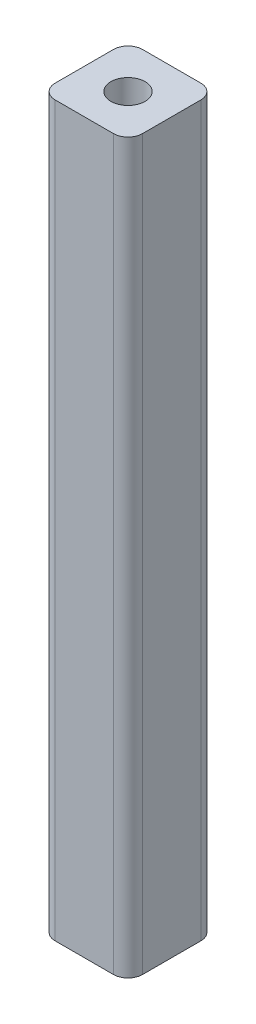
ISO-10303-21;
HEADER;
FILE_DESCRIPTION(('STEP AP214'),'2;1');
FILE_NAME('part.step','',(''),(''),'','','');
FILE_SCHEMA(('AUTOMOTIVE_DESIGN { 1 0 10303 214 1 1 1 1 }'));
ENDSEC;
DATA;
#1=APPLICATION_CONTEXT('core data for automotive mechanical design processes');
#2=APPLICATION_PROTOCOL_DEFINITION('international standard','automotive_design',2000,#1);
#3=PRODUCT_CONTEXT('',#1,'mechanical');
#4=PRODUCT('Part','Part','',(#3));
#5=PRODUCT_RELATED_PRODUCT_CATEGORY('part','',(#4));
#6=PRODUCT_DEFINITION_FORMATION('','',#4);
#7=PRODUCT_DEFINITION_CONTEXT('part definition',#1,'design');
#8=PRODUCT_DEFINITION('design','',#6,#7);
#9=PRODUCT_DEFINITION_SHAPE('','',#8);
#10=(LENGTH_UNIT() NAMED_UNIT(*) SI_UNIT(.MILLI.,.METRE.));
#11=(NAMED_UNIT(*) PLANE_ANGLE_UNIT() SI_UNIT($,.RADIAN.));
#12=(NAMED_UNIT(*) SI_UNIT($,.STERADIAN.) SOLID_ANGLE_UNIT());
#13=UNCERTAINTY_MEASURE_WITH_UNIT(LENGTH_MEASURE(1.E-05),#10,'distance_accuracy_value','');
#14=(GEOMETRIC_REPRESENTATION_CONTEXT(3) GLOBAL_UNCERTAINTY_ASSIGNED_CONTEXT((#13)) GLOBAL_UNIT_ASSIGNED_CONTEXT((#10,
#11,#12)) REPRESENTATION_CONTEXT('',''));
#15=CARTESIAN_POINT('',(0.,0.,0.));
#16=DIRECTION('',(0.,0.,1.));
#17=DIRECTION('',(1.,0.,0.));
#18=AXIS2_PLACEMENT_3D('',#15,#16,#17);
#19=CARTESIAN_POINT('',(0.,100.,0.));
#20=DIRECTION('',(0.,1.,0.));
#21=DIRECTION('',(0.,0.,1.));
#22=AXIS2_PLACEMENT_3D('',#19,#20,#21);
#23=PLANE('',#22);
#24=DIRECTION('',(0.,0.,1.));
#25=VECTOR('',#24,1.);
#26=CARTESIAN_POINT('',(-6.,100.,-6.));
#27=LINE('',#26,#25);
#28=CARTESIAN_POINT('',(-6.,100.,-4.));
#29=VERTEX_POINT('',#28);
#30=CARTESIAN_POINT('',(-6.,100.,4.));
#31=VERTEX_POINT('',#30);
#32=EDGE_CURVE('E138',#29,#31,#27,.T.);
#33=ORIENTED_EDGE('',*,*,#32,.T.);
#34=CARTESIAN_POINT('',(-4.,100.,4.));
#35=DIRECTION('',(0.,1.,0.));
#36=DIRECTION('',(0.,0.,1.));
#37=AXIS2_PLACEMENT_3D('',#34,#35,#36);
#38=CIRCLE('',#37,2.);
#39=CARTESIAN_POINT('',(-4.,100.,6.));
#40=VERTEX_POINT('',#39);
#41=EDGE_CURVE('E153',#31,#40,#38,.T.);
#42=ORIENTED_EDGE('',*,*,#41,.T.);
#43=DIRECTION('',(1.,0.,0.));
#44=VECTOR('',#43,1.);
#45=CARTESIAN_POINT('',(-6.,100.,6.));
#46=LINE('',#45,#44);
#47=CARTESIAN_POINT('',(4.,100.,6.));
#48=VERTEX_POINT('',#47);
#49=EDGE_CURVE('E120',#40,#48,#46,.T.);
#50=ORIENTED_EDGE('',*,*,#49,.T.);
#51=CARTESIAN_POINT('',(4.,100.,4.));
#52=DIRECTION('',(0.,1.,0.));
#53=DIRECTION('',(0.,0.,1.));
#54=AXIS2_PLACEMENT_3D('',#51,#52,#53);
#55=CIRCLE('',#54,2.);
#56=CARTESIAN_POINT('',(6.,100.,4.));
#57=VERTEX_POINT('',#56);
#58=EDGE_CURVE('E148',#48,#57,#55,.T.);
#59=ORIENTED_EDGE('',*,*,#58,.T.);
#60=DIRECTION('',(0.,0.,-1.));
#61=VECTOR('',#60,1.);
#62=CARTESIAN_POINT('',(6.,100.,-6.));
#63=LINE('',#62,#61);
#64=CARTESIAN_POINT('',(6.,100.,-4.));
#65=VERTEX_POINT('',#64);
#66=EDGE_CURVE('E164',#57,#65,#63,.T.);
#67=ORIENTED_EDGE('',*,*,#66,.T.);
#68=CARTESIAN_POINT('',(4.,100.,-4.));
#69=DIRECTION('',(0.,1.,0.));
#70=DIRECTION('',(0.,0.,1.));
#71=AXIS2_PLACEMENT_3D('',#68,#69,#70);
#72=CIRCLE('',#71,2.);
#73=CARTESIAN_POINT('',(4.,100.,-6.));
#74=VERTEX_POINT('',#73);
#75=EDGE_CURVE('E56',#65,#74,#72,.T.);
#76=ORIENTED_EDGE('',*,*,#75,.T.);
#77=DIRECTION('',(-1.,0.,0.));
#78=VECTOR('',#77,1.);
#79=CARTESIAN_POINT('',(-6.,100.,-6.));
#80=LINE('',#79,#78);
#81=CARTESIAN_POINT('',(-4.,100.,-6.));
#82=VERTEX_POINT('',#81);
#83=EDGE_CURVE('E139',#74,#82,#80,.T.);
#84=ORIENTED_EDGE('',*,*,#83,.T.);
#85=CARTESIAN_POINT('',(-4.,100.,-4.));
#86=DIRECTION('',(0.,1.,0.));
#87=DIRECTION('',(0.,0.,1.));
#88=AXIS2_PLACEMENT_3D('',#85,#86,#87);
#89=CIRCLE('',#88,2.);
#90=EDGE_CURVE('E151',#82,#29,#89,.T.);
#91=ORIENTED_EDGE('',*,*,#90,.T.);
#92=EDGE_LOOP('',(#33,#42,#50,#59,#67,#76,#84,#91));
#93=FACE_BOUND('',#92,.T.);
#94=CARTESIAN_POINT('',(0.,100.,0.));
#95=DIRECTION('',(0.,1.,0.));
#96=DIRECTION('',(0.,0.,1.));
#97=AXIS2_PLACEMENT_3D('',#94,#95,#96);
#98=CIRCLE('',#97,2.35);
#99=CARTESIAN_POINT('',(0.,100.,2.35));
#100=VERTEX_POINT('',#99);
#101=EDGE_CURVE('E133',#100,#100,#98,.T.);
#102=ORIENTED_EDGE('',*,*,#101,.F.);
#103=EDGE_LOOP('',(#102));
#104=FACE_BOUND('',#103,.T.);
#105=ADVANCED_FACE('F34',(#93,#104),#23,.T.);
#106=CARTESIAN_POINT('',(0.,0.,0.));
#107=DIRECTION('',(0.,1.,0.));
#108=DIRECTION('',(0.,0.,1.));
#109=AXIS2_PLACEMENT_3D('',#106,#107,#108);
#110=PLANE('',#109);
#111=DIRECTION('',(1.,0.,0.));
#112=VECTOR('',#111,1.);
#113=CARTESIAN_POINT('',(-6.,0.,6.));
#114=LINE('',#113,#112);
#115=CARTESIAN_POINT('',(-4.,0.,6.));
#116=VERTEX_POINT('',#115);
#117=CARTESIAN_POINT('',(4.,0.,6.));
#118=VERTEX_POINT('',#117);
#119=EDGE_CURVE('E117',#116,#118,#114,.T.);
#120=ORIENTED_EDGE('',*,*,#119,.F.);
#121=CARTESIAN_POINT('',(-4.,0.,4.));
#122=DIRECTION('',(0.,1.,0.));
#123=DIRECTION('',(0.,0.,1.));
#124=AXIS2_PLACEMENT_3D('',#121,#122,#123);
#125=CIRCLE('',#124,2.);
#126=CARTESIAN_POINT('',(-6.,0.,4.));
#127=VERTEX_POINT('',#126);
#128=EDGE_CURVE('E100',#116,#127,#125,.F.);
#129=ORIENTED_EDGE('',*,*,#128,.T.);
#130=DIRECTION('',(0.,0.,1.));
#131=VECTOR('',#130,1.);
#132=CARTESIAN_POINT('',(-6.,0.,-6.));
#133=LINE('',#132,#131);
#134=CARTESIAN_POINT('',(-6.,0.,-4.));
#135=VERTEX_POINT('',#134);
#136=EDGE_CURVE('E128',#135,#127,#133,.T.);
#137=ORIENTED_EDGE('',*,*,#136,.F.);
#138=CARTESIAN_POINT('',(-4.,0.,-4.));
#139=DIRECTION('',(0.,1.,0.));
#140=DIRECTION('',(0.,0.,1.));
#141=AXIS2_PLACEMENT_3D('',#138,#139,#140);
#142=CIRCLE('',#141,2.);
#143=CARTESIAN_POINT('',(-4.,0.,-6.));
#144=VERTEX_POINT('',#143);
#145=EDGE_CURVE('E111',#135,#144,#142,.F.);
#146=ORIENTED_EDGE('',*,*,#145,.T.);
#147=DIRECTION('',(-1.,0.,0.));
#148=VECTOR('',#147,1.);
#149=CARTESIAN_POINT('',(-6.,0.,-6.));
#150=LINE('',#149,#148);
#151=CARTESIAN_POINT('',(4.,0.,-6.));
#152=VERTEX_POINT('',#151);
#153=EDGE_CURVE('E131',#152,#144,#150,.T.);
#154=ORIENTED_EDGE('',*,*,#153,.F.);
#155=CARTESIAN_POINT('',(4.,0.,-4.));
#156=DIRECTION('',(0.,1.,0.));
#157=DIRECTION('',(0.,0.,1.));
#158=AXIS2_PLACEMENT_3D('',#155,#156,#157);
#159=CIRCLE('',#158,2.);
#160=CARTESIAN_POINT('',(6.,0.,-4.));
#161=VERTEX_POINT('',#160);
#162=EDGE_CURVE('E142',#152,#161,#159,.F.);
#163=ORIENTED_EDGE('',*,*,#162,.T.);
#164=DIRECTION('',(0.,0.,-1.));
#165=VECTOR('',#164,1.);
#166=CARTESIAN_POINT('',(6.,0.,-6.));
#167=LINE('',#166,#165);
#168=CARTESIAN_POINT('',(6.,0.,4.));
#169=VERTEX_POINT('',#168);
#170=EDGE_CURVE('E127',#169,#161,#167,.T.);
#171=ORIENTED_EDGE('',*,*,#170,.F.);
#172=CARTESIAN_POINT('',(4.,0.,4.));
#173=DIRECTION('',(0.,1.,0.));
#174=DIRECTION('',(0.,0.,1.));
#175=AXIS2_PLACEMENT_3D('',#172,#173,#174);
#176=CIRCLE('',#175,2.);
#177=EDGE_CURVE('E121',#169,#118,#176,.F.);
#178=ORIENTED_EDGE('',*,*,#177,.T.);
#179=EDGE_LOOP('',(#120,#129,#137,#146,#154,#163,#171,#178));
#180=FACE_BOUND('',#179,.T.);
#181=CARTESIAN_POINT('',(0.,0.,0.));
#182=DIRECTION('',(0.,1.,0.));
#183=DIRECTION('',(0.,0.,1.));
#184=AXIS2_PLACEMENT_3D('',#181,#182,#183);
#185=CIRCLE('',#184,2.35);
#186=CARTESIAN_POINT('',(0.,0.,2.35));
#187=VERTEX_POINT('',#186);
#188=EDGE_CURVE('E178',#187,#187,#185,.T.);
#189=ORIENTED_EDGE('',*,*,#188,.T.);
#190=EDGE_LOOP('',(#189));
#191=FACE_BOUND('',#190,.T.);
#192=ADVANCED_FACE('F124',(#180,#191),#110,.F.);
#193=CARTESIAN_POINT('',(-6.,100.,-6.));
#194=DIRECTION('',(1.,0.,0.));
#195=DIRECTION('',(0.,0.,-1.));
#196=AXIS2_PLACEMENT_3D('',#193,#194,#195);
#197=PLANE('',#196);
#198=ORIENTED_EDGE('',*,*,#136,.T.);
#199=DIRECTION('',(0.,-1.,0.));
#200=VECTOR('',#199,1.);
#201=CARTESIAN_POINT('',(-6.,100.,4.));
#202=LINE('',#201,#200);
#203=EDGE_CURVE('E105',#127,#31,#202,.F.);
#204=ORIENTED_EDGE('',*,*,#203,.T.);
#205=ORIENTED_EDGE('',*,*,#32,.F.);
#206=DIRECTION('',(0.,-1.,0.));
#207=VECTOR('',#206,1.);
#208=CARTESIAN_POINT('',(-6.,100.,-4.));
#209=LINE('',#208,#207);
#210=EDGE_CURVE('E110',#29,#135,#209,.T.);
#211=ORIENTED_EDGE('',*,*,#210,.T.);
#212=EDGE_LOOP('',(#198,#204,#205,#211));
#213=FACE_BOUND('',#212,.T.);
#214=ADVANCED_FACE('F192',(#213),#197,.F.);
#215=CARTESIAN_POINT('',(-6.,100.,6.));
#216=DIRECTION('',(0.,0.,-1.));
#217=DIRECTION('',(-1.,0.,0.));
#218=AXIS2_PLACEMENT_3D('',#215,#216,#217);
#219=PLANE('',#218);
#220=ORIENTED_EDGE('',*,*,#49,.F.);
#221=DIRECTION('',(0.,-1.,0.));
#222=VECTOR('',#221,1.);
#223=CARTESIAN_POINT('',(-4.,100.,6.));
#224=LINE('',#223,#222);
#225=EDGE_CURVE('E104',#40,#116,#224,.T.);
#226=ORIENTED_EDGE('',*,*,#225,.T.);
#227=ORIENTED_EDGE('',*,*,#119,.T.);
#228=DIRECTION('',(0.,-1.,0.));
#229=VECTOR('',#228,1.);
#230=CARTESIAN_POINT('',(4.,100.,6.));
#231=LINE('',#230,#229);
#232=EDGE_CURVE('E122',#118,#48,#231,.F.);
#233=ORIENTED_EDGE('',*,*,#232,.T.);
#234=EDGE_LOOP('',(#220,#226,#227,#233));
#235=FACE_BOUND('',#234,.T.);
#236=ADVANCED_FACE('F116',(#235),#219,.F.);
#237=CARTESIAN_POINT('',(6.,100.,-6.));
#238=DIRECTION('',(-1.,0.,0.));
#239=DIRECTION('',(0.,0.,1.));
#240=AXIS2_PLACEMENT_3D('',#237,#238,#239);
#241=PLANE('',#240);
#242=ORIENTED_EDGE('',*,*,#170,.T.);
#243=DIRECTION('',(0.,-1.,0.));
#244=VECTOR('',#243,1.);
#245=CARTESIAN_POINT('',(6.,100.,-4.));
#246=LINE('',#245,#244);
#247=EDGE_CURVE('E11',#161,#65,#246,.F.);
#248=ORIENTED_EDGE('',*,*,#247,.T.);
#249=ORIENTED_EDGE('',*,*,#66,.F.);
#250=DIRECTION('',(0.,-1.,0.));
#251=VECTOR('',#250,1.);
#252=CARTESIAN_POINT('',(6.,100.,4.));
#253=LINE('',#252,#251);
#254=EDGE_CURVE('E42',#57,#169,#253,.T.);
#255=ORIENTED_EDGE('',*,*,#254,.T.);
#256=EDGE_LOOP('',(#242,#248,#249,#255));
#257=FACE_BOUND('',#256,.T.);
#258=ADVANCED_FACE('F162',(#257),#241,.F.);
#259=CARTESIAN_POINT('',(-6.,100.,-6.));
#260=DIRECTION('',(0.,0.,1.));
#261=DIRECTION('',(1.,0.,0.));
#262=AXIS2_PLACEMENT_3D('',#259,#260,#261);
#263=PLANE('',#262);
#264=ORIENTED_EDGE('',*,*,#153,.T.);
#265=DIRECTION('',(0.,-1.,0.));
#266=VECTOR('',#265,1.);
#267=CARTESIAN_POINT('',(-4.,100.,-6.));
#268=LINE('',#267,#266);
#269=EDGE_CURVE('E49',#144,#82,#268,.F.);
#270=ORIENTED_EDGE('',*,*,#269,.T.);
#271=ORIENTED_EDGE('',*,*,#83,.F.);
#272=DIRECTION('',(0.,-1.,0.));
#273=VECTOR('',#272,1.);
#274=CARTESIAN_POINT('',(4.,100.,-6.));
#275=LINE('',#274,#273);
#276=EDGE_CURVE('E155',#74,#152,#275,.T.);
#277=ORIENTED_EDGE('',*,*,#276,.T.);
#278=EDGE_LOOP('',(#264,#270,#271,#277));
#279=FACE_BOUND('',#278,.T.);
#280=ADVANCED_FACE('F171',(#279),#263,.F.);
#281=CARTESIAN_POINT('',(0.,100.,0.));
#282=DIRECTION('',(0.,-1.,0.));
#283=DIRECTION('',(0.,0.,-1.));
#284=AXIS2_PLACEMENT_3D('',#281,#282,#283);
#285=CYLINDRICAL_SURFACE('',#284,2.35);
#286=ORIENTED_EDGE('',*,*,#101,.T.);
#287=EDGE_LOOP('',(#286));
#288=FACE_BOUND('',#287,.T.);
#289=ORIENTED_EDGE('',*,*,#188,.F.);
#290=EDGE_LOOP('',(#289));
#291=FACE_BOUND('',#290,.T.);
#292=ADVANCED_FACE('F184',(#288,#291),#285,.F.);
#293=CARTESIAN_POINT('',(-4.,100.,4.));
#294=DIRECTION('',(0.,-1.,0.));
#295=DIRECTION('',(0.,0.,-1.));
#296=AXIS2_PLACEMENT_3D('',#293,#294,#295);
#297=CYLINDRICAL_SURFACE('',#296,2.);
#298=ORIENTED_EDGE('',*,*,#41,.F.);
#299=ORIENTED_EDGE('',*,*,#203,.F.);
#300=ORIENTED_EDGE('',*,*,#128,.F.);
#301=ORIENTED_EDGE('',*,*,#225,.F.);
#302=EDGE_LOOP('',(#298,#299,#300,#301));
#303=FACE_BOUND('',#302,.T.);
#304=ADVANCED_FACE('F103',(#303),#297,.T.);
#305=CARTESIAN_POINT('',(-4.,100.,-4.));
#306=DIRECTION('',(0.,-1.,0.));
#307=DIRECTION('',(0.,0.,-1.));
#308=AXIS2_PLACEMENT_3D('',#305,#306,#307);
#309=CYLINDRICAL_SURFACE('',#308,2.);
#310=ORIENTED_EDGE('',*,*,#90,.F.);
#311=ORIENTED_EDGE('',*,*,#269,.F.);
#312=ORIENTED_EDGE('',*,*,#145,.F.);
#313=ORIENTED_EDGE('',*,*,#210,.F.);
#314=EDGE_LOOP('',(#310,#311,#312,#313));
#315=FACE_BOUND('',#314,.T.);
#316=ADVANCED_FACE('F207',(#315),#309,.T.);
#317=CARTESIAN_POINT('',(4.,100.,-4.));
#318=DIRECTION('',(0.,-1.,0.));
#319=DIRECTION('',(0.,0.,-1.));
#320=AXIS2_PLACEMENT_3D('',#317,#318,#319);
#321=CYLINDRICAL_SURFACE('',#320,2.);
#322=ORIENTED_EDGE('',*,*,#75,.F.);
#323=ORIENTED_EDGE('',*,*,#247,.F.);
#324=ORIENTED_EDGE('',*,*,#162,.F.);
#325=ORIENTED_EDGE('',*,*,#276,.F.);
#326=EDGE_LOOP('',(#322,#323,#324,#325));
#327=FACE_BOUND('',#326,.T.);
#328=ADVANCED_FACE('F170',(#327),#321,.T.);
#329=CARTESIAN_POINT('',(4.,100.,4.));
#330=DIRECTION('',(0.,-1.,0.));
#331=DIRECTION('',(0.,0.,-1.));
#332=AXIS2_PLACEMENT_3D('',#329,#330,#331);
#333=CYLINDRICAL_SURFACE('',#332,2.);
#334=ORIENTED_EDGE('',*,*,#58,.F.);
#335=ORIENTED_EDGE('',*,*,#232,.F.);
#336=ORIENTED_EDGE('',*,*,#177,.F.);
#337=ORIENTED_EDGE('',*,*,#254,.F.);
#338=EDGE_LOOP('',(#334,#335,#336,#337));
#339=FACE_BOUND('',#338,.T.);
#340=ADVANCED_FACE('F36',(#339),#333,.T.);
#341=CLOSED_SHELL('',(#105,#192,#214,#236,#258,#280,#292,#304,#316,#328,#340));
#342=MANIFOLD_SOLID_BREP('B2',#341);
#343=ADVANCED_BREP_SHAPE_REPRESENTATION('',(#18,#342),#14);
#344=SHAPE_DEFINITION_REPRESENTATION(#9,#343);
ENDSEC;
END-ISO-10303-21;
